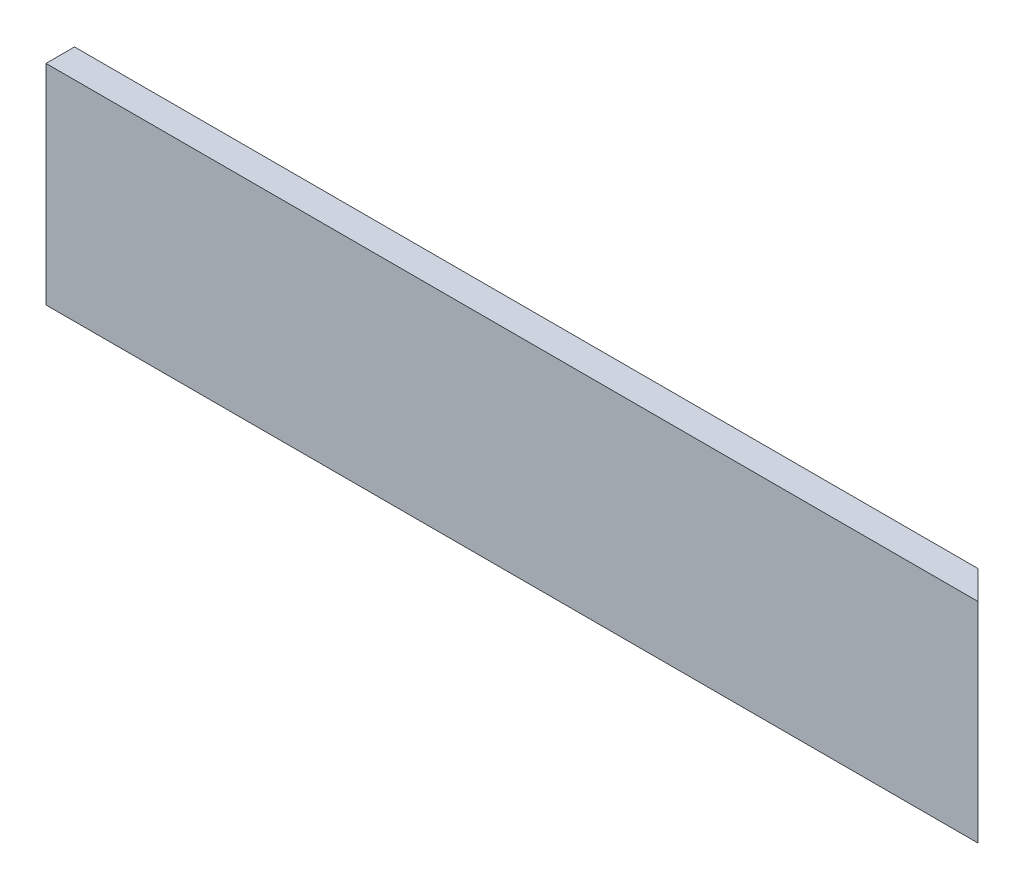
ISO-10303-21;
HEADER;
FILE_DESCRIPTION(('STEP AP214'),'2;1');
FILE_NAME('part.step','',(''),(''),'','','');
FILE_SCHEMA(('AUTOMOTIVE_DESIGN { 1 0 10303 214 1 1 1 1 }'));
ENDSEC;
DATA;
#1=APPLICATION_CONTEXT('core data for automotive mechanical design processes');
#2=APPLICATION_PROTOCOL_DEFINITION('international standard','automotive_design',2000,#1);
#3=PRODUCT_CONTEXT('',#1,'mechanical');
#4=PRODUCT('Part','Part','',(#3));
#5=PRODUCT_RELATED_PRODUCT_CATEGORY('part','',(#4));
#6=PRODUCT_DEFINITION_FORMATION('','',#4);
#7=PRODUCT_DEFINITION_CONTEXT('part definition',#1,'design');
#8=PRODUCT_DEFINITION('design','',#6,#7);
#9=PRODUCT_DEFINITION_SHAPE('','',#8);
#10=(LENGTH_UNIT() NAMED_UNIT(*) SI_UNIT(.MILLI.,.METRE.));
#11=(NAMED_UNIT(*) PLANE_ANGLE_UNIT() SI_UNIT($,.RADIAN.));
#12=(NAMED_UNIT(*) SI_UNIT($,.STERADIAN.) SOLID_ANGLE_UNIT());
#13=UNCERTAINTY_MEASURE_WITH_UNIT(LENGTH_MEASURE(1.E-05),#10,'distance_accuracy_value','');
#14=(GEOMETRIC_REPRESENTATION_CONTEXT(3) GLOBAL_UNCERTAINTY_ASSIGNED_CONTEXT((#13)) GLOBAL_UNIT_ASSIGNED_CONTEXT((#10,
#11,#12)) REPRESENTATION_CONTEXT('',''));
#15=CARTESIAN_POINT('',(0.,0.,0.));
#16=DIRECTION('',(0.,0.,1.));
#17=DIRECTION('',(1.,0.,0.));
#18=AXIS2_PLACEMENT_3D('',#15,#16,#17);
#19=CARTESIAN_POINT('',(588.,0.,18.));
#20=DIRECTION('',(0.707106781186548,0.,-0.707106781186548));
#21=DIRECTION('',(0.,-1.,0.));
#22=AXIS2_PLACEMENT_3D('',#19,#20,#21);
#23=PLANE('',#22);
#24=DIRECTION('',(0.,1.,0.));
#25=VECTOR('',#24,1.);
#26=CARTESIAN_POINT('',(588.,0.,18.));
#27=LINE('',#26,#25);
#28=CARTESIAN_POINT('',(588.,0.,18.));
#29=VERTEX_POINT('',#28);
#30=CARTESIAN_POINT('',(588.,132.,18.));
#31=VERTEX_POINT('',#30);
#32=EDGE_CURVE('E82',#29,#31,#27,.T.);
#33=ORIENTED_EDGE('',*,*,#32,.F.);
#34=DIRECTION('',(0.707106781186548,0.,0.707106781186548));
#35=VECTOR('',#34,1.);
#36=CARTESIAN_POINT('',(588.,0.,18.));
#37=LINE('',#36,#35);
#38=CARTESIAN_POINT('',(570.,0.,0.));
#39=VERTEX_POINT('',#38);
#40=EDGE_CURVE('E43',#39,#29,#37,.T.);
#41=ORIENTED_EDGE('',*,*,#40,.F.);
#42=DIRECTION('',(0.,-1.,0.));
#43=VECTOR('',#42,1.);
#44=CARTESIAN_POINT('',(570.,0.,0.));
#45=LINE('',#44,#43);
#46=CARTESIAN_POINT('',(570.,132.,0.));
#47=VERTEX_POINT('',#46);
#48=EDGE_CURVE('E96',#47,#39,#45,.T.);
#49=ORIENTED_EDGE('',*,*,#48,.F.);
#50=DIRECTION('',(-0.707106781186548,0.,-0.707106781186548));
#51=VECTOR('',#50,1.);
#52=CARTESIAN_POINT('',(588.,132.,18.));
#53=LINE('',#52,#51);
#54=EDGE_CURVE('E13',#31,#47,#53,.T.);
#55=ORIENTED_EDGE('',*,*,#54,.F.);
#56=EDGE_LOOP('',(#33,#41,#49,#55));
#57=FACE_BOUND('',#56,.T.);
#58=ADVANCED_FACE('F36',(#57),#23,.T.);
#59=CARTESIAN_POINT('',(0.,0.,18.));
#60=DIRECTION('',(1.,0.,0.));
#61=DIRECTION('',(0.,0.,-1.));
#62=AXIS2_PLACEMENT_3D('',#59,#60,#61);
#63=PLANE('',#62);
#64=DIRECTION('',(0.,-1.,0.));
#65=VECTOR('',#64,1.);
#66=CARTESIAN_POINT('',(0.,0.,0.));
#67=LINE('',#66,#65);
#68=CARTESIAN_POINT('',(0.,132.,0.));
#69=VERTEX_POINT('',#68);
#70=CARTESIAN_POINT('',(0.,0.,0.));
#71=VERTEX_POINT('',#70);
#72=EDGE_CURVE('E95',#69,#71,#67,.T.);
#73=ORIENTED_EDGE('',*,*,#72,.T.);
#74=DIRECTION('',(0.,0.,-1.));
#75=VECTOR('',#74,1.);
#76=CARTESIAN_POINT('',(0.,0.,18.));
#77=LINE('',#76,#75);
#78=CARTESIAN_POINT('',(0.,0.,18.));
#79=VERTEX_POINT('',#78);
#80=EDGE_CURVE('E78',#79,#71,#77,.T.);
#81=ORIENTED_EDGE('',*,*,#80,.F.);
#82=DIRECTION('',(0.,-1.,0.));
#83=VECTOR('',#82,1.);
#84=CARTESIAN_POINT('',(0.,0.,18.));
#85=LINE('',#84,#83);
#86=CARTESIAN_POINT('',(0.,132.,18.));
#87=VERTEX_POINT('',#86);
#88=EDGE_CURVE('E83',#87,#79,#85,.T.);
#89=ORIENTED_EDGE('',*,*,#88,.F.);
#90=DIRECTION('',(0.,0.,-1.));
#91=VECTOR('',#90,1.);
#92=CARTESIAN_POINT('',(0.,132.,18.));
#93=LINE('',#92,#91);
#94=EDGE_CURVE('E97',#87,#69,#93,.T.);
#95=ORIENTED_EDGE('',*,*,#94,.T.);
#96=EDGE_LOOP('',(#73,#81,#89,#95));
#97=FACE_BOUND('',#96,.T.);
#98=ADVANCED_FACE('F93',(#97),#63,.F.);
#99=CARTESIAN_POINT('',(0.,0.,18.));
#100=DIRECTION('',(0.,1.,0.));
#101=DIRECTION('',(0.,0.,1.));
#102=AXIS2_PLACEMENT_3D('',#99,#100,#101);
#103=PLANE('',#102);
#104=DIRECTION('',(1.,0.,0.));
#105=VECTOR('',#104,1.);
#106=CARTESIAN_POINT('',(0.,0.,0.));
#107=LINE('',#106,#105);
#108=EDGE_CURVE('E103',#71,#39,#107,.T.);
#109=ORIENTED_EDGE('',*,*,#108,.T.);
#110=ORIENTED_EDGE('',*,*,#40,.T.);
#111=DIRECTION('',(1.,0.,0.));
#112=VECTOR('',#111,1.);
#113=CARTESIAN_POINT('',(0.,0.,18.));
#114=LINE('',#113,#112);
#115=EDGE_CURVE('E73',#79,#29,#114,.T.);
#116=ORIENTED_EDGE('',*,*,#115,.F.);
#117=ORIENTED_EDGE('',*,*,#80,.T.);
#118=EDGE_LOOP('',(#109,#110,#116,#117));
#119=FACE_BOUND('',#118,.T.);
#120=ADVANCED_FACE('F76',(#119),#103,.F.);
#121=CARTESIAN_POINT('',(0.,132.,18.));
#122=DIRECTION('',(0.,-1.,0.));
#123=DIRECTION('',(0.,0.,-1.));
#124=AXIS2_PLACEMENT_3D('',#121,#122,#123);
#125=PLANE('',#124);
#126=DIRECTION('',(-1.,0.,0.));
#127=VECTOR('',#126,1.);
#128=CARTESIAN_POINT('',(0.,132.,18.));
#129=LINE('',#128,#127);
#130=EDGE_CURVE('E87',#31,#87,#129,.T.);
#131=ORIENTED_EDGE('',*,*,#130,.F.);
#132=ORIENTED_EDGE('',*,*,#54,.T.);
#133=DIRECTION('',(-1.,0.,0.));
#134=VECTOR('',#133,1.);
#135=CARTESIAN_POINT('',(0.,132.,0.));
#136=LINE('',#135,#134);
#137=EDGE_CURVE('E91',#47,#69,#136,.T.);
#138=ORIENTED_EDGE('',*,*,#137,.T.);
#139=ORIENTED_EDGE('',*,*,#94,.F.);
#140=EDGE_LOOP('',(#131,#132,#138,#139));
#141=FACE_BOUND('',#140,.T.);
#142=ADVANCED_FACE('F107',(#141),#125,.F.);
#143=CARTESIAN_POINT('',(0.,0.,18.));
#144=DIRECTION('',(0.,0.,-1.));
#145=DIRECTION('',(-1.,0.,0.));
#146=AXIS2_PLACEMENT_3D('',#143,#144,#145);
#147=PLANE('',#146);
#148=ORIENTED_EDGE('',*,*,#88,.T.);
#149=ORIENTED_EDGE('',*,*,#115,.T.);
#150=ORIENTED_EDGE('',*,*,#32,.T.);
#151=ORIENTED_EDGE('',*,*,#130,.T.);
#152=EDGE_LOOP('',(#148,#149,#150,#151));
#153=FACE_BOUND('',#152,.T.);
#154=ADVANCED_FACE('F86',(#153),#147,.F.);
#155=CARTESIAN_POINT('',(0.,0.,0.));
#156=DIRECTION('',(0.,0.,-1.));
#157=DIRECTION('',(-1.,0.,0.));
#158=AXIS2_PLACEMENT_3D('',#155,#156,#157);
#159=PLANE('',#158);
#160=ORIENTED_EDGE('',*,*,#137,.F.);
#161=ORIENTED_EDGE('',*,*,#48,.T.);
#162=ORIENTED_EDGE('',*,*,#108,.F.);
#163=ORIENTED_EDGE('',*,*,#72,.F.);
#164=EDGE_LOOP('',(#160,#161,#162,#163));
#165=FACE_BOUND('',#164,.T.);
#166=ADVANCED_FACE('F110',(#165),#159,.T.);
#167=CLOSED_SHELL('',(#58,#98,#120,#142,#154,#166));
#168=MANIFOLD_SOLID_BREP('B2',#167);
#169=ADVANCED_BREP_SHAPE_REPRESENTATION('',(#18,#168),#14);
#170=SHAPE_DEFINITION_REPRESENTATION(#9,#169);
ENDSEC;
END-ISO-10303-21;
